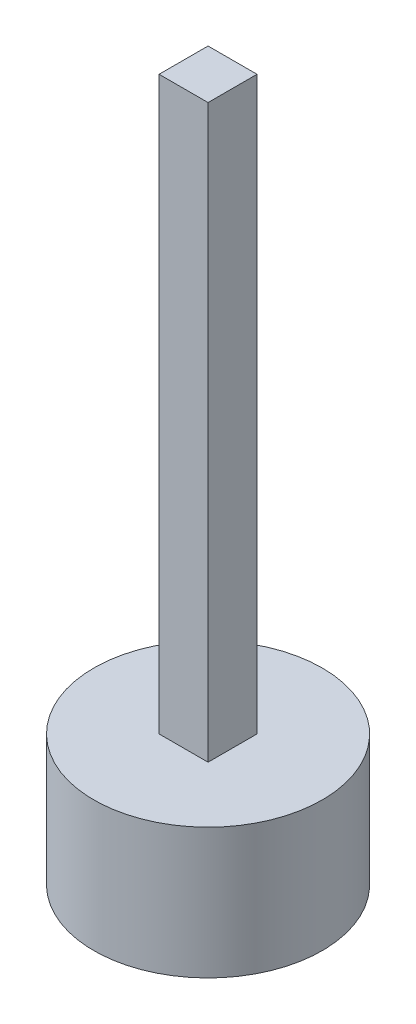
ISO-10303-21;
HEADER;
FILE_DESCRIPTION(('STEP AP214'),'2;1');
FILE_NAME('part.step','',(''),(''),'','','');
FILE_SCHEMA(('AUTOMOTIVE_DESIGN { 1 0 10303 214 1 1 1 1 }'));
ENDSEC;
DATA;
#1=APPLICATION_CONTEXT('core data for automotive mechanical design processes');
#2=APPLICATION_PROTOCOL_DEFINITION('international standard','automotive_design',2000,#1);
#3=PRODUCT_CONTEXT('',#1,'mechanical');
#4=PRODUCT('Part','Part','',(#3));
#5=PRODUCT_RELATED_PRODUCT_CATEGORY('part','',(#4));
#6=PRODUCT_DEFINITION_FORMATION('','',#4);
#7=PRODUCT_DEFINITION_CONTEXT('part definition',#1,'design');
#8=PRODUCT_DEFINITION('design','',#6,#7);
#9=PRODUCT_DEFINITION_SHAPE('','',#8);
#10=(LENGTH_UNIT() NAMED_UNIT(*) SI_UNIT(.MILLI.,.METRE.));
#11=(NAMED_UNIT(*) PLANE_ANGLE_UNIT() SI_UNIT($,.RADIAN.));
#12=(NAMED_UNIT(*) SI_UNIT($,.STERADIAN.) SOLID_ANGLE_UNIT());
#13=UNCERTAINTY_MEASURE_WITH_UNIT(LENGTH_MEASURE(1.E-05),#10,'distance_accuracy_value','');
#14=(GEOMETRIC_REPRESENTATION_CONTEXT(3) GLOBAL_UNCERTAINTY_ASSIGNED_CONTEXT((#13)) GLOBAL_UNIT_ASSIGNED_CONTEXT((#10,
#11,#12)) REPRESENTATION_CONTEXT('',''));
#15=CARTESIAN_POINT('',(0.,0.,0.));
#16=DIRECTION('',(0.,0.,1.));
#17=DIRECTION('',(1.,0.,0.));
#18=AXIS2_PLACEMENT_3D('',#15,#16,#17);
#19=CARTESIAN_POINT('',(15.,-350.,0.));
#20=DIRECTION('',(1.,0.,0.));
#21=DIRECTION('',(0.,0.,-1.));
#22=AXIS2_PLACEMENT_3D('',#19,#20,#21);
#23=PLANE('',#22);
#24=DIRECTION('',(0.,0.,-1.));
#25=VECTOR('',#24,1.);
#26=CARTESIAN_POINT('',(15.,0.,0.));
#27=LINE('',#26,#25);
#28=CARTESIAN_POINT('',(15.,0.,0.));
#29=VERTEX_POINT('',#28);
#30=CARTESIAN_POINT('',(15.,0.,-30.));
#31=VERTEX_POINT('',#30);
#32=EDGE_CURVE('E101',#29,#31,#27,.T.);
#33=ORIENTED_EDGE('',*,*,#32,.F.);
#34=DIRECTION('',(0.,1.,0.));
#35=VECTOR('',#34,1.);
#36=CARTESIAN_POINT('',(15.,-350.,0.));
#37=LINE('',#36,#35);
#38=CARTESIAN_POINT('',(15.,-350.,0.));
#39=VERTEX_POINT('',#38);
#40=EDGE_CURVE('E11',#39,#29,#37,.T.);
#41=ORIENTED_EDGE('',*,*,#40,.F.);
#42=DIRECTION('',(0.,0.,-1.));
#43=VECTOR('',#42,1.);
#44=CARTESIAN_POINT('',(15.,-350.,0.));
#45=LINE('',#44,#43);
#46=CARTESIAN_POINT('',(15.,-350.,-30.));
#47=VERTEX_POINT('',#46);
#48=EDGE_CURVE('E86',#39,#47,#45,.T.);
#49=ORIENTED_EDGE('',*,*,#48,.T.);
#50=DIRECTION('',(0.,1.,0.));
#51=VECTOR('',#50,1.);
#52=CARTESIAN_POINT('',(15.,-350.,-30.));
#53=LINE('',#52,#51);
#54=EDGE_CURVE('E35',#47,#31,#53,.T.);
#55=ORIENTED_EDGE('',*,*,#54,.T.);
#56=EDGE_LOOP('',(#33,#41,#49,#55));
#57=FACE_BOUND('',#56,.T.);
#58=ADVANCED_FACE('F32',(#57),#23,.T.);
#59=CARTESIAN_POINT('',(15.,-350.,0.));
#60=DIRECTION('',(0.,0.,1.));
#61=DIRECTION('',(1.,0.,0.));
#62=AXIS2_PLACEMENT_3D('',#59,#60,#61);
#63=PLANE('',#62);
#64=DIRECTION('',(1.,0.,0.));
#65=VECTOR('',#64,1.);
#66=CARTESIAN_POINT('',(15.,0.,0.));
#67=LINE('',#66,#65);
#68=CARTESIAN_POINT('',(-15.,0.,0.));
#69=VERTEX_POINT('',#68);
#70=EDGE_CURVE('E79',#69,#29,#67,.T.);
#71=ORIENTED_EDGE('',*,*,#70,.F.);
#72=DIRECTION('',(0.,1.,0.));
#73=VECTOR('',#72,1.);
#74=CARTESIAN_POINT('',(-15.,-350.,0.));
#75=LINE('',#74,#73);
#76=CARTESIAN_POINT('',(-15.,-350.,0.));
#77=VERTEX_POINT('',#76);
#78=EDGE_CURVE('E41',#77,#69,#75,.T.);
#79=ORIENTED_EDGE('',*,*,#78,.F.);
#80=DIRECTION('',(1.,0.,0.));
#81=VECTOR('',#80,1.);
#82=CARTESIAN_POINT('',(15.,-350.,0.));
#83=LINE('',#82,#81);
#84=EDGE_CURVE('E94',#77,#39,#83,.T.);
#85=ORIENTED_EDGE('',*,*,#84,.T.);
#86=ORIENTED_EDGE('',*,*,#40,.T.);
#87=EDGE_LOOP('',(#71,#79,#85,#86));
#88=FACE_BOUND('',#87,.T.);
#89=ADVANCED_FACE('F83',(#88),#63,.T.);
#90=CARTESIAN_POINT('',(-15.,-350.,0.));
#91=DIRECTION('',(-1.,0.,0.));
#92=DIRECTION('',(0.,0.,1.));
#93=AXIS2_PLACEMENT_3D('',#90,#91,#92);
#94=PLANE('',#93);
#95=DIRECTION('',(0.,0.,1.));
#96=VECTOR('',#95,1.);
#97=CARTESIAN_POINT('',(-15.,0.,0.));
#98=LINE('',#97,#96);
#99=CARTESIAN_POINT('',(-15.,0.,-30.));
#100=VERTEX_POINT('',#99);
#101=EDGE_CURVE('E67',#100,#69,#98,.T.);
#102=ORIENTED_EDGE('',*,*,#101,.F.);
#103=DIRECTION('',(0.,1.,0.));
#104=VECTOR('',#103,1.);
#105=CARTESIAN_POINT('',(-15.,-350.,-30.));
#106=LINE('',#105,#104);
#107=CARTESIAN_POINT('',(-15.,-350.,-30.));
#108=VERTEX_POINT('',#107);
#109=EDGE_CURVE('E73',#108,#100,#106,.T.);
#110=ORIENTED_EDGE('',*,*,#109,.F.);
#111=DIRECTION('',(0.,0.,1.));
#112=VECTOR('',#111,1.);
#113=CARTESIAN_POINT('',(-15.,-350.,0.));
#114=LINE('',#113,#112);
#115=EDGE_CURVE('E49',#108,#77,#114,.T.);
#116=ORIENTED_EDGE('',*,*,#115,.T.);
#117=ORIENTED_EDGE('',*,*,#78,.T.);
#118=EDGE_LOOP('',(#102,#110,#116,#117));
#119=FACE_BOUND('',#118,.T.);
#120=ADVANCED_FACE('F66',(#119),#94,.T.);
#121=CARTESIAN_POINT('',(15.,-350.,-30.));
#122=DIRECTION('',(0.,0.,-1.));
#123=DIRECTION('',(-1.,0.,0.));
#124=AXIS2_PLACEMENT_3D('',#121,#122,#123);
#125=PLANE('',#124);
#126=DIRECTION('',(-1.,0.,0.));
#127=VECTOR('',#126,1.);
#128=CARTESIAN_POINT('',(15.,0.,-30.));
#129=LINE('',#128,#127);
#130=EDGE_CURVE('E81',#31,#100,#129,.T.);
#131=ORIENTED_EDGE('',*,*,#130,.F.);
#132=ORIENTED_EDGE('',*,*,#54,.F.);
#133=DIRECTION('',(-1.,0.,0.));
#134=VECTOR('',#133,1.);
#135=CARTESIAN_POINT('',(15.,-350.,-30.));
#136=LINE('',#135,#134);
#137=EDGE_CURVE('E89',#47,#108,#136,.T.);
#138=ORIENTED_EDGE('',*,*,#137,.T.);
#139=ORIENTED_EDGE('',*,*,#109,.T.);
#140=EDGE_LOOP('',(#131,#132,#138,#139));
#141=FACE_BOUND('',#140,.T.);
#142=ADVANCED_FACE('F110',(#141),#125,.T.);
#143=CARTESIAN_POINT('',(0.,0.,0.));
#144=DIRECTION('',(0.,1.,0.));
#145=DIRECTION('',(0.,0.,1.));
#146=AXIS2_PLACEMENT_3D('',#143,#144,#145);
#147=PLANE('',#146);
#148=ORIENTED_EDGE('',*,*,#32,.T.);
#149=ORIENTED_EDGE('',*,*,#130,.T.);
#150=ORIENTED_EDGE('',*,*,#101,.T.);
#151=ORIENTED_EDGE('',*,*,#70,.T.);
#152=EDGE_LOOP('',(#148,#149,#150,#151));
#153=FACE_BOUND('',#152,.T.);
#154=ADVANCED_FACE('F78',(#153),#147,.T.);
#155=CARTESIAN_POINT('',(0.,-430.,-15.));
#156=DIRECTION('',(0.,1.,0.));
#157=DIRECTION('',(0.,0.,1.));
#158=AXIS2_PLACEMENT_3D('',#155,#156,#157);
#159=CYLINDRICAL_SURFACE('',#158,70.);
#160=CARTESIAN_POINT('',(0.,-430.,-15.));
#161=DIRECTION('',(0.,-1.,0.));
#162=DIRECTION('',(0.,0.,-1.));
#163=AXIS2_PLACEMENT_3D('',#160,#161,#162);
#164=CIRCLE('',#163,70.);
#165=CARTESIAN_POINT('',(0.,-430.,-85.));
#166=VERTEX_POINT('',#165);
#167=EDGE_CURVE('E102',#166,#166,#164,.T.);
#168=ORIENTED_EDGE('',*,*,#167,.F.);
#169=EDGE_LOOP('',(#168));
#170=FACE_BOUND('',#169,.T.);
#171=CARTESIAN_POINT('',(0.,-350.,-15.));
#172=DIRECTION('',(0.,-1.,0.));
#173=DIRECTION('',(0.,0.,-1.));
#174=AXIS2_PLACEMENT_3D('',#171,#172,#173);
#175=CIRCLE('',#174,70.);
#176=CARTESIAN_POINT('',(0.,-350.,-85.));
#177=VERTEX_POINT('',#176);
#178=EDGE_CURVE('E104',#177,#177,#175,.T.);
#179=ORIENTED_EDGE('',*,*,#178,.T.);
#180=EDGE_LOOP('',(#179));
#181=FACE_BOUND('',#180,.T.);
#182=ADVANCED_FACE('F131',(#170,#181),#159,.T.);
#183=CARTESIAN_POINT('',(0.,-430.,-15.));
#184=DIRECTION('',(0.,-1.,0.));
#185=DIRECTION('',(0.,0.,-1.));
#186=AXIS2_PLACEMENT_3D('',#183,#184,#185);
#187=PLANE('',#186);
#188=ORIENTED_EDGE('',*,*,#167,.T.);
#189=EDGE_LOOP('',(#188));
#190=FACE_BOUND('',#189,.T.);
#191=ADVANCED_FACE('F135',(#190),#187,.T.);
#192=CARTESIAN_POINT('',(0.,-350.,-15.));
#193=DIRECTION('',(0.,-1.,0.));
#194=DIRECTION('',(0.,0.,-1.));
#195=AXIS2_PLACEMENT_3D('',#192,#193,#194);
#196=PLANE('',#195);
#197=ORIENTED_EDGE('',*,*,#48,.F.);
#198=ORIENTED_EDGE('',*,*,#84,.F.);
#199=ORIENTED_EDGE('',*,*,#115,.F.);
#200=ORIENTED_EDGE('',*,*,#137,.F.);
#201=EDGE_LOOP('',(#197,#198,#199,#200));
#202=FACE_BOUND('',#201,.T.);
#203=ORIENTED_EDGE('',*,*,#178,.F.);
#204=EDGE_LOOP('',(#203));
#205=FACE_BOUND('',#204,.T.);
#206=ADVANCED_FACE('F113',(#202,#205),#196,.F.);
#207=CLOSED_SHELL('',(#58,#89,#120,#142,#154,#182,#191,#206));
#208=MANIFOLD_SOLID_BREP('B2',#207);
#209=ADVANCED_BREP_SHAPE_REPRESENTATION('',(#18,#208),#14);
#210=SHAPE_DEFINITION_REPRESENTATION(#9,#209);
ENDSEC;
END-ISO-10303-21;
